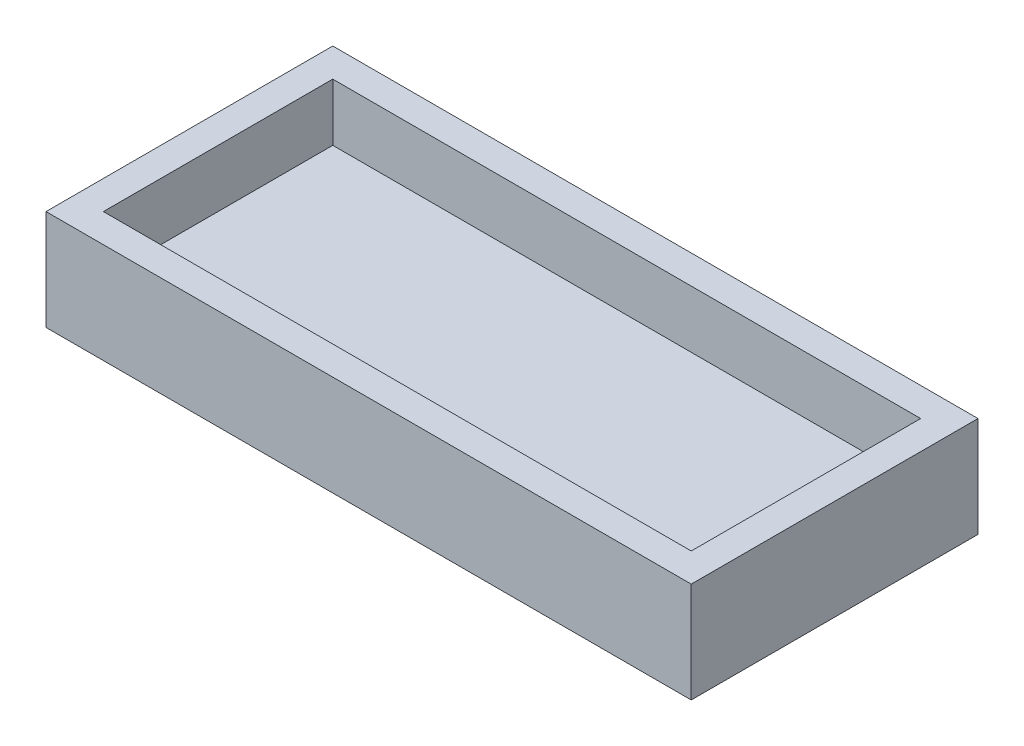
ISO-10303-21;
HEADER;
FILE_DESCRIPTION(('STEP AP214'),'2;1');
FILE_NAME('part.step','',(''),(''),'','','');
FILE_SCHEMA(('AUTOMOTIVE_DESIGN { 1 0 10303 214 1 1 1 1 }'));
ENDSEC;
DATA;
#1=APPLICATION_CONTEXT('core data for automotive mechanical design processes');
#2=APPLICATION_PROTOCOL_DEFINITION('international standard','automotive_design',2000,#1);
#3=PRODUCT_CONTEXT('',#1,'mechanical');
#4=PRODUCT('Part','Part','',(#3));
#5=PRODUCT_RELATED_PRODUCT_CATEGORY('part','',(#4));
#6=PRODUCT_DEFINITION_FORMATION('','',#4);
#7=PRODUCT_DEFINITION_CONTEXT('part definition',#1,'design');
#8=PRODUCT_DEFINITION('design','',#6,#7);
#9=PRODUCT_DEFINITION_SHAPE('','',#8);
#10=(LENGTH_UNIT() NAMED_UNIT(*) SI_UNIT(.MILLI.,.METRE.));
#11=(NAMED_UNIT(*) PLANE_ANGLE_UNIT() SI_UNIT($,.RADIAN.));
#12=(NAMED_UNIT(*) SI_UNIT($,.STERADIAN.) SOLID_ANGLE_UNIT());
#13=UNCERTAINTY_MEASURE_WITH_UNIT(LENGTH_MEASURE(1.E-05),#10,'distance_accuracy_value','');
#14=(GEOMETRIC_REPRESENTATION_CONTEXT(3) GLOBAL_UNCERTAINTY_ASSIGNED_CONTEXT((#13)) GLOBAL_UNIT_ASSIGNED_CONTEXT((#10,
#11,#12)) REPRESENTATION_CONTEXT('',''));
#15=CARTESIAN_POINT('',(0.,0.,0.));
#16=DIRECTION('',(0.,0.,1.));
#17=DIRECTION('',(1.,0.,0.));
#18=AXIS2_PLACEMENT_3D('',#15,#16,#17);
#19=CARTESIAN_POINT('',(0.,3.,0.));
#20=DIRECTION('',(0.,1.,0.));
#21=DIRECTION('',(0.,0.,1.));
#22=AXIS2_PLACEMENT_3D('',#19,#20,#21);
#23=PLANE('',#22);
#24=DIRECTION('',(0.,0.,-1.));
#25=VECTOR('',#24,1.);
#26=CARTESIAN_POINT('',(20.5,3.,-8.));
#27=LINE('',#26,#25);
#28=CARTESIAN_POINT('',(20.5,3.,8.));
#29=VERTEX_POINT('',#28);
#30=CARTESIAN_POINT('',(20.5,3.,-8.));
#31=VERTEX_POINT('',#30);
#32=EDGE_CURVE('E147',#29,#31,#27,.T.);
#33=ORIENTED_EDGE('',*,*,#32,.T.);
#34=DIRECTION('',(-1.,0.,0.));
#35=VECTOR('',#34,1.);
#36=CARTESIAN_POINT('',(-20.5,3.,-8.));
#37=LINE('',#36,#35);
#38=CARTESIAN_POINT('',(-20.5,3.,-8.00000000000001));
#39=VERTEX_POINT('',#38);
#40=EDGE_CURVE('E60',#31,#39,#37,.T.);
#41=ORIENTED_EDGE('',*,*,#40,.T.);
#42=DIRECTION('',(0.,0.,1.));
#43=VECTOR('',#42,1.);
#44=CARTESIAN_POINT('',(-20.5,3.,-8.));
#45=LINE('',#44,#43);
#46=CARTESIAN_POINT('',(-20.5,3.,7.99999999999999));
#47=VERTEX_POINT('',#46);
#48=EDGE_CURVE('E45',#39,#47,#45,.T.);
#49=ORIENTED_EDGE('',*,*,#48,.T.);
#50=DIRECTION('',(1.,0.,0.));
#51=VECTOR('',#50,1.);
#52=CARTESIAN_POINT('',(-20.5,3.,8.));
#53=LINE('',#52,#51);
#54=EDGE_CURVE('E12',#47,#29,#53,.T.);
#55=ORIENTED_EDGE('',*,*,#54,.T.);
#56=EDGE_LOOP('',(#33,#41,#49,#55));
#57=FACE_BOUND('',#56,.T.);
#58=ADVANCED_FACE('F37',(#57),#23,.T.);
#59=CARTESIAN_POINT('',(22.5,60.2442890089805,-10.));
#60=DIRECTION('',(0.,0.,-1.));
#61=DIRECTION('',(-1.,0.,0.));
#62=AXIS2_PLACEMENT_3D('',#59,#60,#61);
#63=PLANE('',#62);
#64=DIRECTION('',(0.,-1.,0.));
#65=VECTOR('',#64,1.);
#66=CARTESIAN_POINT('',(-22.5,60.2442890089805,-10.));
#67=LINE('',#66,#65);
#68=CARTESIAN_POINT('',(-22.5,7.,-10.));
#69=VERTEX_POINT('',#68);
#70=CARTESIAN_POINT('',(-22.5,0.,-10.));
#71=VERTEX_POINT('',#70);
#72=EDGE_CURVE('E115',#69,#71,#67,.T.);
#73=ORIENTED_EDGE('',*,*,#72,.F.);
#74=DIRECTION('',(1.,0.,0.));
#75=VECTOR('',#74,1.);
#76=CARTESIAN_POINT('',(22.5,7.,-10.));
#77=LINE('',#76,#75);
#78=CARTESIAN_POINT('',(22.5,7.,-10.));
#79=VERTEX_POINT('',#78);
#80=EDGE_CURVE('E148',#69,#79,#77,.T.);
#81=ORIENTED_EDGE('',*,*,#80,.T.);
#82=DIRECTION('',(0.,-1.,0.));
#83=VECTOR('',#82,1.);
#84=CARTESIAN_POINT('',(22.5,60.2442890089805,-10.));
#85=LINE('',#84,#83);
#86=CARTESIAN_POINT('',(22.5,0.,-10.));
#87=VERTEX_POINT('',#86);
#88=EDGE_CURVE('E129',#79,#87,#85,.T.);
#89=ORIENTED_EDGE('',*,*,#88,.T.);
#90=DIRECTION('',(1.,0.,0.));
#91=VECTOR('',#90,1.);
#92=CARTESIAN_POINT('',(22.5,0.,-10.));
#93=LINE('',#92,#91);
#94=EDGE_CURVE('E134',#71,#87,#93,.T.);
#95=ORIENTED_EDGE('',*,*,#94,.F.);
#96=EDGE_LOOP('',(#73,#81,#89,#95));
#97=FACE_BOUND('',#96,.T.);
#98=ADVANCED_FACE('F182',(#97),#63,.T.);
#99=CARTESIAN_POINT('',(-22.5,60.2442890089805,-10.));
#100=DIRECTION('',(-1.,0.,0.));
#101=DIRECTION('',(0.,0.,1.));
#102=AXIS2_PLACEMENT_3D('',#99,#100,#101);
#103=PLANE('',#102);
#104=DIRECTION('',(0.,-1.,0.));
#105=VECTOR('',#104,1.);
#106=CARTESIAN_POINT('',(-22.5,60.2442890089805,9.99999999999999));
#107=LINE('',#106,#105);
#108=CARTESIAN_POINT('',(-22.5,7.,9.99999999999999));
#109=VERTEX_POINT('',#108);
#110=CARTESIAN_POINT('',(-22.5,0.,9.99999999999999));
#111=VERTEX_POINT('',#110);
#112=EDGE_CURVE('E114',#109,#111,#107,.T.);
#113=ORIENTED_EDGE('',*,*,#112,.F.);
#114=DIRECTION('',(0.,0.,-1.));
#115=VECTOR('',#114,1.);
#116=CARTESIAN_POINT('',(-22.5,7.,-10.));
#117=LINE('',#116,#115);
#118=EDGE_CURVE('E111',#109,#69,#117,.T.);
#119=ORIENTED_EDGE('',*,*,#118,.T.);
#120=ORIENTED_EDGE('',*,*,#72,.T.);
#121=DIRECTION('',(0.,0.,-1.));
#122=VECTOR('',#121,1.);
#123=CARTESIAN_POINT('',(-22.5,0.,-10.));
#124=LINE('',#123,#122);
#125=EDGE_CURVE('E143',#111,#71,#124,.T.);
#126=ORIENTED_EDGE('',*,*,#125,.F.);
#127=EDGE_LOOP('',(#113,#119,#120,#126));
#128=FACE_BOUND('',#127,.T.);
#129=ADVANCED_FACE('F186',(#128),#103,.T.);
#130=CARTESIAN_POINT('',(22.5,60.2442890089805,10.));
#131=DIRECTION('',(0.,0.,1.));
#132=DIRECTION('',(1.,0.,0.));
#133=AXIS2_PLACEMENT_3D('',#130,#131,#132);
#134=PLANE('',#133);
#135=DIRECTION('',(0.,-1.,0.));
#136=VECTOR('',#135,1.);
#137=CARTESIAN_POINT('',(22.5,60.2442890089805,10.));
#138=LINE('',#137,#136);
#139=CARTESIAN_POINT('',(22.5,7.,10.));
#140=VERTEX_POINT('',#139);
#141=CARTESIAN_POINT('',(22.5,0.,10.));
#142=VERTEX_POINT('',#141);
#143=EDGE_CURVE('E118',#140,#142,#138,.T.);
#144=ORIENTED_EDGE('',*,*,#143,.F.);
#145=DIRECTION('',(-1.,0.,0.));
#146=VECTOR('',#145,1.);
#147=CARTESIAN_POINT('',(22.5,7.,10.));
#148=LINE('',#147,#146);
#149=EDGE_CURVE('E103',#140,#109,#148,.T.);
#150=ORIENTED_EDGE('',*,*,#149,.T.);
#151=ORIENTED_EDGE('',*,*,#112,.T.);
#152=DIRECTION('',(-1.,0.,0.));
#153=VECTOR('',#152,1.);
#154=CARTESIAN_POINT('',(22.5,0.,10.));
#155=LINE('',#154,#153);
#156=EDGE_CURVE('E121',#142,#111,#155,.T.);
#157=ORIENTED_EDGE('',*,*,#156,.F.);
#158=EDGE_LOOP('',(#144,#150,#151,#157));
#159=FACE_BOUND('',#158,.T.);
#160=ADVANCED_FACE('F119',(#159),#134,.T.);
#161=CARTESIAN_POINT('',(22.5,60.2442890089805,-10.));
#162=DIRECTION('',(1.,0.,0.));
#163=DIRECTION('',(0.,0.,-1.));
#164=AXIS2_PLACEMENT_3D('',#161,#162,#163);
#165=PLANE('',#164);
#166=ORIENTED_EDGE('',*,*,#88,.F.);
#167=DIRECTION('',(0.,0.,1.));
#168=VECTOR('',#167,1.);
#169=CARTESIAN_POINT('',(22.5,7.,-10.));
#170=LINE('',#169,#168);
#171=EDGE_CURVE('E108',#79,#140,#170,.T.);
#172=ORIENTED_EDGE('',*,*,#171,.T.);
#173=ORIENTED_EDGE('',*,*,#143,.T.);
#174=DIRECTION('',(0.,0.,1.));
#175=VECTOR('',#174,1.);
#176=CARTESIAN_POINT('',(22.5,0.,-10.));
#177=LINE('',#176,#175);
#178=EDGE_CURVE('E270',#87,#142,#177,.T.);
#179=ORIENTED_EDGE('',*,*,#178,.F.);
#180=EDGE_LOOP('',(#166,#172,#173,#179));
#181=FACE_BOUND('',#180,.T.);
#182=ADVANCED_FACE('F128',(#181),#165,.T.);
#183=CARTESIAN_POINT('',(20.5,60.2442890089805,-8.));
#184=DIRECTION('',(1.,0.,0.));
#185=DIRECTION('',(0.,0.,-1.));
#186=AXIS2_PLACEMENT_3D('',#183,#184,#185);
#187=PLANE('',#186);
#188=ORIENTED_EDGE('',*,*,#32,.F.);
#189=DIRECTION('',(0.,-1.,0.));
#190=VECTOR('',#189,1.);
#191=CARTESIAN_POINT('',(20.5,60.2442890089805,8.));
#192=LINE('',#191,#190);
#193=CARTESIAN_POINT('',(20.5,7.,8.));
#194=VERTEX_POINT('',#193);
#195=EDGE_CURVE('E52',#194,#29,#192,.T.);
#196=ORIENTED_EDGE('',*,*,#195,.F.);
#197=DIRECTION('',(0.,0.,1.));
#198=VECTOR('',#197,1.);
#199=CARTESIAN_POINT('',(20.5,7.,-8.));
#200=LINE('',#199,#198);
#201=CARTESIAN_POINT('',(20.5,7.,-8.));
#202=VERTEX_POINT('',#201);
#203=EDGE_CURVE('E136',#202,#194,#200,.T.);
#204=ORIENTED_EDGE('',*,*,#203,.F.);
#205=DIRECTION('',(0.,-1.,0.));
#206=VECTOR('',#205,1.);
#207=CARTESIAN_POINT('',(20.5,60.2442890089805,-8.));
#208=LINE('',#207,#206);
#209=EDGE_CURVE('E125',#202,#31,#208,.T.);
#210=ORIENTED_EDGE('',*,*,#209,.T.);
#211=EDGE_LOOP('',(#188,#196,#204,#210));
#212=FACE_BOUND('',#211,.T.);
#213=ADVANCED_FACE('F189',(#212),#187,.F.);
#214=CARTESIAN_POINT('',(20.5,60.2442890089805,-8.));
#215=DIRECTION('',(0.,0.,-1.));
#216=DIRECTION('',(-1.,0.,0.));
#217=AXIS2_PLACEMENT_3D('',#214,#215,#216);
#218=PLANE('',#217);
#219=ORIENTED_EDGE('',*,*,#40,.F.);
#220=ORIENTED_EDGE('',*,*,#209,.F.);
#221=DIRECTION('',(1.,0.,0.));
#222=VECTOR('',#221,1.);
#223=CARTESIAN_POINT('',(20.5,7.,-8.));
#224=LINE('',#223,#222);
#225=CARTESIAN_POINT('',(-20.5,7.,-8.00000000000001));
#226=VERTEX_POINT('',#225);
#227=EDGE_CURVE('E140',#226,#202,#224,.T.);
#228=ORIENTED_EDGE('',*,*,#227,.F.);
#229=DIRECTION('',(0.,-1.,0.));
#230=VECTOR('',#229,1.);
#231=CARTESIAN_POINT('',(-20.5,60.2442890089805,-8.00000000000001));
#232=LINE('',#231,#230);
#233=EDGE_CURVE('E156',#226,#39,#232,.T.);
#234=ORIENTED_EDGE('',*,*,#233,.T.);
#235=EDGE_LOOP('',(#219,#220,#228,#234));
#236=FACE_BOUND('',#235,.T.);
#237=ADVANCED_FACE('F170',(#236),#218,.F.);
#238=CARTESIAN_POINT('',(-20.5,60.2442890089805,-8.00000000000001));
#239=DIRECTION('',(-1.,0.,0.));
#240=DIRECTION('',(0.,0.,1.));
#241=AXIS2_PLACEMENT_3D('',#238,#239,#240);
#242=PLANE('',#241);
#243=ORIENTED_EDGE('',*,*,#48,.F.);
#244=ORIENTED_EDGE('',*,*,#233,.F.);
#245=DIRECTION('',(0.,0.,-1.));
#246=VECTOR('',#245,1.);
#247=CARTESIAN_POINT('',(-20.5,7.,-8.00000000000001));
#248=LINE('',#247,#246);
#249=CARTESIAN_POINT('',(-20.5,7.,7.99999999999999));
#250=VERTEX_POINT('',#249);
#251=EDGE_CURVE('E144',#250,#226,#248,.T.);
#252=ORIENTED_EDGE('',*,*,#251,.F.);
#253=DIRECTION('',(0.,-1.,0.));
#254=VECTOR('',#253,1.);
#255=CARTESIAN_POINT('',(-20.5,60.2442890089805,7.99999999999999));
#256=LINE('',#255,#254);
#257=EDGE_CURVE('E158',#250,#47,#256,.T.);
#258=ORIENTED_EDGE('',*,*,#257,.T.);
#259=EDGE_LOOP('',(#243,#244,#252,#258));
#260=FACE_BOUND('',#259,.T.);
#261=ADVANCED_FACE('F168',(#260),#242,.F.);
#262=CARTESIAN_POINT('',(20.5,60.2442890089805,8.));
#263=DIRECTION('',(0.,0.,1.));
#264=DIRECTION('',(1.,0.,0.));
#265=AXIS2_PLACEMENT_3D('',#262,#263,#264);
#266=PLANE('',#265);
#267=ORIENTED_EDGE('',*,*,#54,.F.);
#268=ORIENTED_EDGE('',*,*,#257,.F.);
#269=DIRECTION('',(-1.,0.,0.));
#270=VECTOR('',#269,1.);
#271=CARTESIAN_POINT('',(20.5,7.,8.));
#272=LINE('',#271,#270);
#273=EDGE_CURVE('E139',#194,#250,#272,.T.);
#274=ORIENTED_EDGE('',*,*,#273,.F.);
#275=ORIENTED_EDGE('',*,*,#195,.T.);
#276=EDGE_LOOP('',(#267,#268,#274,#275));
#277=FACE_BOUND('',#276,.T.);
#278=ADVANCED_FACE('F171',(#277),#266,.F.);
#279=CARTESIAN_POINT('',(0.,7.,0.));
#280=DIRECTION('',(0.,1.,0.));
#281=DIRECTION('',(0.,0.,1.));
#282=AXIS2_PLACEMENT_3D('',#279,#280,#281);
#283=PLANE('',#282);
#284=ORIENTED_EDGE('',*,*,#80,.F.);
#285=ORIENTED_EDGE('',*,*,#118,.F.);
#286=ORIENTED_EDGE('',*,*,#149,.F.);
#287=ORIENTED_EDGE('',*,*,#171,.F.);
#288=EDGE_LOOP('',(#284,#285,#286,#287));
#289=FACE_BOUND('',#288,.T.);
#290=ORIENTED_EDGE('',*,*,#227,.T.);
#291=ORIENTED_EDGE('',*,*,#203,.T.);
#292=ORIENTED_EDGE('',*,*,#273,.T.);
#293=ORIENTED_EDGE('',*,*,#251,.T.);
#294=EDGE_LOOP('',(#290,#291,#292,#293));
#295=FACE_BOUND('',#294,.T.);
#296=ADVANCED_FACE('F105',(#289,#295),#283,.T.);
#297=CARTESIAN_POINT('',(0.,0.,0.));
#298=DIRECTION('',(0.,1.,0.));
#299=DIRECTION('',(0.,0.,1.));
#300=AXIS2_PLACEMENT_3D('',#297,#298,#299);
#301=PLANE('',#300);
#302=ORIENTED_EDGE('',*,*,#94,.T.);
#303=ORIENTED_EDGE('',*,*,#178,.T.);
#304=ORIENTED_EDGE('',*,*,#156,.T.);
#305=ORIENTED_EDGE('',*,*,#125,.T.);
#306=EDGE_LOOP('',(#302,#303,#304,#305));
#307=FACE_BOUND('',#306,.T.);
#308=ADVANCED_FACE('F39',(#307),#301,.F.);
#309=CLOSED_SHELL('',(#58,#98,#129,#160,#182,#213,#237,#261,#278,#296,#308));
#310=MANIFOLD_SOLID_BREP('B2',#309);
#311=ADVANCED_BREP_SHAPE_REPRESENTATION('',(#18,#310),#14);
#312=SHAPE_DEFINITION_REPRESENTATION(#9,#311);
ENDSEC;
END-ISO-10303-21;
